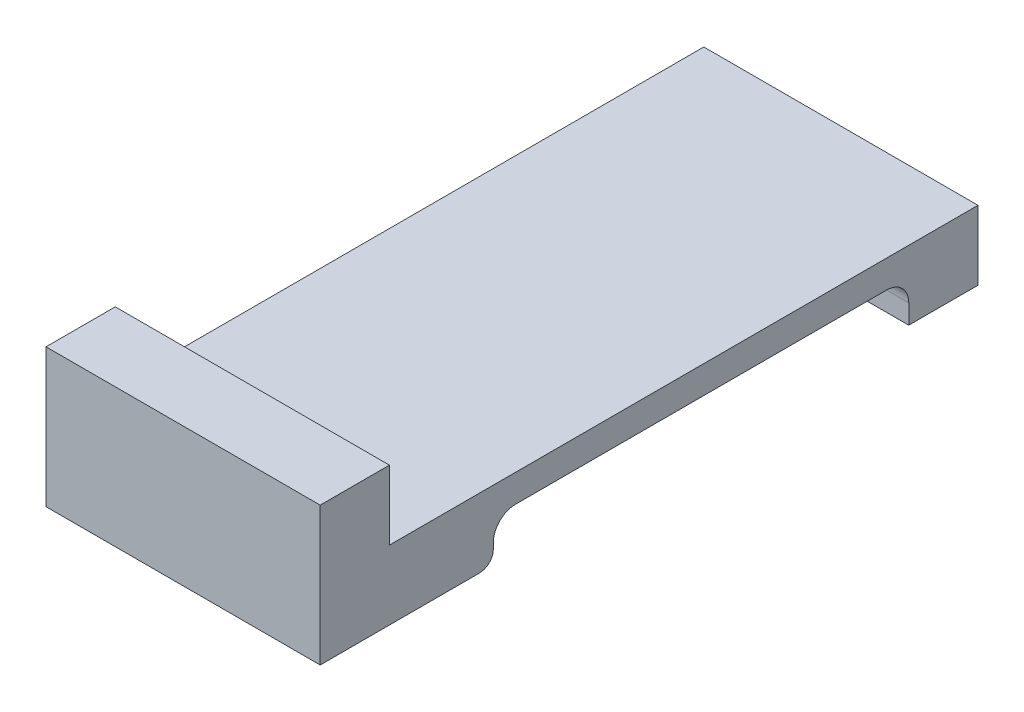
ISO-10303-21;
HEADER;
FILE_DESCRIPTION(('STEP AP214'),'2;1');
FILE_NAME('part.step','',(''),(''),'','','');
FILE_SCHEMA(('AUTOMOTIVE_DESIGN { 1 0 10303 214 1 1 1 1 }'));
ENDSEC;
DATA;
#1=APPLICATION_CONTEXT('core data for automotive mechanical design processes');
#2=APPLICATION_PROTOCOL_DEFINITION('international standard','automotive_design',2000,#1);
#3=PRODUCT_CONTEXT('',#1,'mechanical');
#4=PRODUCT('Part','Part','',(#3));
#5=PRODUCT_RELATED_PRODUCT_CATEGORY('part','',(#4));
#6=PRODUCT_DEFINITION_FORMATION('','',#4);
#7=PRODUCT_DEFINITION_CONTEXT('part definition',#1,'design');
#8=PRODUCT_DEFINITION('design','',#6,#7);
#9=PRODUCT_DEFINITION_SHAPE('','',#8);
#10=(LENGTH_UNIT() NAMED_UNIT(*) SI_UNIT(.MILLI.,.METRE.));
#11=(NAMED_UNIT(*) PLANE_ANGLE_UNIT() SI_UNIT($,.RADIAN.));
#12=(NAMED_UNIT(*) SI_UNIT($,.STERADIAN.) SOLID_ANGLE_UNIT());
#13=UNCERTAINTY_MEASURE_WITH_UNIT(LENGTH_MEASURE(1.E-05),#10,'distance_accuracy_value','');
#14=(GEOMETRIC_REPRESENTATION_CONTEXT(3) GLOBAL_UNCERTAINTY_ASSIGNED_CONTEXT((#13)) GLOBAL_UNIT_ASSIGNED_CONTEXT((#10,
#11,#12)) REPRESENTATION_CONTEXT('',''));
#15=CARTESIAN_POINT('',(0.,0.,0.));
#16=DIRECTION('',(0.,0.,1.));
#17=DIRECTION('',(1.,0.,0.));
#18=AXIS2_PLACEMENT_3D('',#15,#16,#17);
#19=CARTESIAN_POINT('',(12.573,0.,0.));
#20=DIRECTION('',(0.,1.,0.));
#21=DIRECTION('',(0.,0.,1.));
#22=AXIS2_PLACEMENT_3D('',#19,#20,#21);
#23=PLANE('',#22);
#24=DIRECTION('',(0.,0.,-1.));
#25=VECTOR('',#24,1.);
#26=CARTESIAN_POINT('',(0.,0.,0.));
#27=LINE('',#26,#25);
#28=CARTESIAN_POINT('',(0.,0.,0.));
#29=VERTEX_POINT('',#28);
#30=CARTESIAN_POINT('',(0.,0.,-7.3025));
#31=VERTEX_POINT('',#30);
#32=EDGE_CURVE('E170',#29,#31,#27,.T.);
#33=ORIENTED_EDGE('',*,*,#32,.T.);
#34=DIRECTION('',(-1.,0.,0.));
#35=VECTOR('',#34,1.);
#36=CARTESIAN_POINT('',(12.573,0.,-7.3025));
#37=LINE('',#36,#35);
#38=CARTESIAN_POINT('',(12.573,0.,-7.3025));
#39=VERTEX_POINT('',#38);
#40=EDGE_CURVE('E11',#39,#31,#37,.T.);
#41=ORIENTED_EDGE('',*,*,#40,.F.);
#42=DIRECTION('',(0.,0.,-1.));
#43=VECTOR('',#42,1.);
#44=CARTESIAN_POINT('',(12.573,0.,0.));
#45=LINE('',#44,#43);
#46=CARTESIAN_POINT('',(12.573,0.,0.));
#47=VERTEX_POINT('',#46);
#48=EDGE_CURVE('E207',#47,#39,#45,.T.);
#49=ORIENTED_EDGE('',*,*,#48,.F.);
#50=DIRECTION('',(-1.,0.,0.));
#51=VECTOR('',#50,1.);
#52=CARTESIAN_POINT('',(12.573,0.,0.));
#53=LINE('',#52,#51);
#54=EDGE_CURVE('E166',#47,#29,#53,.T.);
#55=ORIENTED_EDGE('',*,*,#54,.T.);
#56=EDGE_LOOP('',(#33,#41,#49,#55));
#57=FACE_BOUND('',#56,.T.);
#58=ADVANCED_FACE('F39',(#57),#23,.F.);
#59=CARTESIAN_POINT('',(12.573,0.634999999999999,-7.3025));
#60=DIRECTION('',(-1.,0.,0.));
#61=DIRECTION('',(0.,0.,1.));
#62=AXIS2_PLACEMENT_3D('',#59,#60,#61);
#63=CYLINDRICAL_SURFACE('',#62,0.635);
#64=CARTESIAN_POINT('',(0.,0.634999999999999,-7.3025));
#65=DIRECTION('',(1.,0.,0.));
#66=DIRECTION('',(0.,0.,-1.));
#67=AXIS2_PLACEMENT_3D('',#64,#65,#66);
#68=CIRCLE('',#67,0.635);
#69=CARTESIAN_POINT('',(0.,0.635000000000004,-7.9375));
#70=VERTEX_POINT('',#69);
#71=EDGE_CURVE('E174',#31,#70,#68,.T.);
#72=ORIENTED_EDGE('',*,*,#71,.T.);
#73=DIRECTION('',(-1.,0.,0.));
#74=VECTOR('',#73,1.);
#75=CARTESIAN_POINT('',(12.573,0.635000000000004,-7.9375));
#76=LINE('',#75,#74);
#77=CARTESIAN_POINT('',(12.573,0.635000000000004,-7.9375));
#78=VERTEX_POINT('',#77);
#79=EDGE_CURVE('E48',#78,#70,#76,.T.);
#80=ORIENTED_EDGE('',*,*,#79,.F.);
#81=CARTESIAN_POINT('',(12.573,0.634999999999999,-7.3025));
#82=DIRECTION('',(1.,0.,0.));
#83=DIRECTION('',(0.,0.,-1.));
#84=AXIS2_PLACEMENT_3D('',#81,#82,#83);
#85=CIRCLE('',#84,0.635);
#86=EDGE_CURVE('E114',#39,#78,#85,.T.);
#87=ORIENTED_EDGE('',*,*,#86,.F.);
#88=ORIENTED_EDGE('',*,*,#40,.T.);
#89=EDGE_LOOP('',(#72,#80,#87,#88));
#90=FACE_BOUND('',#89,.T.);
#91=ADVANCED_FACE('F308',(#90),#63,.T.);
#92=CARTESIAN_POINT('',(12.573,0.635000000000004,-7.9375));
#93=DIRECTION('',(0.,0.,1.));
#94=DIRECTION('',(0.,-1.,0.));
#95=AXIS2_PLACEMENT_3D('',#92,#93,#94);
#96=PLANE('',#95);
#97=DIRECTION('',(0.,1.,0.));
#98=VECTOR('',#97,1.);
#99=CARTESIAN_POINT('',(0.,0.635000000000004,-7.9375));
#100=LINE('',#99,#98);
#101=CARTESIAN_POINT('',(0.,0.889,-7.9375));
#102=VERTEX_POINT('',#101);
#103=EDGE_CURVE('E177',#70,#102,#100,.T.);
#104=ORIENTED_EDGE('',*,*,#103,.T.);
#105=DIRECTION('',(-1.,0.,0.));
#106=VECTOR('',#105,1.);
#107=CARTESIAN_POINT('',(12.573,0.889,-7.9375));
#108=LINE('',#107,#106);
#109=CARTESIAN_POINT('',(12.573,0.889,-7.9375));
#110=VERTEX_POINT('',#109);
#111=EDGE_CURVE('E238',#110,#102,#108,.T.);
#112=ORIENTED_EDGE('',*,*,#111,.F.);
#113=DIRECTION('',(0.,1.,0.));
#114=VECTOR('',#113,1.);
#115=CARTESIAN_POINT('',(12.573,0.635000000000004,-7.9375));
#116=LINE('',#115,#114);
#117=EDGE_CURVE('E248',#78,#110,#116,.T.);
#118=ORIENTED_EDGE('',*,*,#117,.F.);
#119=ORIENTED_EDGE('',*,*,#79,.T.);
#120=EDGE_LOOP('',(#104,#112,#118,#119));
#121=FACE_BOUND('',#120,.T.);
#122=ADVANCED_FACE('F246',(#121),#96,.F.);
#123=CARTESIAN_POINT('',(12.573,0.889,-8.9535));
#124=DIRECTION('',(-1.,0.,0.));
#125=DIRECTION('',(0.,0.,1.));
#126=AXIS2_PLACEMENT_3D('',#123,#124,#125);
#127=CYLINDRICAL_SURFACE('',#126,1.016);
#128=CARTESIAN_POINT('',(0.,0.889,-8.9535));
#129=DIRECTION('',(-1.,0.,0.));
#130=DIRECTION('',(0.,0.,1.));
#131=AXIS2_PLACEMENT_3D('',#128,#129,#130);
#132=CIRCLE('',#131,1.016);
#133=CARTESIAN_POINT('',(0.,1.905,-8.9535));
#134=VERTEX_POINT('',#133);
#135=EDGE_CURVE('E180',#102,#134,#132,.T.);
#136=ORIENTED_EDGE('',*,*,#135,.T.);
#137=DIRECTION('',(-1.,0.,0.));
#138=VECTOR('',#137,1.);
#139=CARTESIAN_POINT('',(12.573,1.905,-8.9535));
#140=LINE('',#139,#138);
#141=CARTESIAN_POINT('',(12.573,1.905,-8.9535));
#142=VERTEX_POINT('',#141);
#143=EDGE_CURVE('E234',#142,#134,#140,.T.);
#144=ORIENTED_EDGE('',*,*,#143,.F.);
#145=CARTESIAN_POINT('',(12.573,0.889,-8.9535));
#146=DIRECTION('',(-1.,0.,0.));
#147=DIRECTION('',(0.,0.,1.));
#148=AXIS2_PLACEMENT_3D('',#145,#146,#147);
#149=CIRCLE('',#148,1.016);
#150=EDGE_CURVE('E267',#110,#142,#149,.T.);
#151=ORIENTED_EDGE('',*,*,#150,.F.);
#152=ORIENTED_EDGE('',*,*,#111,.T.);
#153=EDGE_LOOP('',(#136,#144,#151,#152));
#154=FACE_BOUND('',#153,.T.);
#155=ADVANCED_FACE('F257',(#154),#127,.F.);
#156=CARTESIAN_POINT('',(12.573,1.905,-8.9535));
#157=DIRECTION('',(0.,1.,0.));
#158=DIRECTION('',(0.,0.,1.));
#159=AXIS2_PLACEMENT_3D('',#156,#157,#158);
#160=PLANE('',#159);
#161=DIRECTION('',(0.,0.,-1.));
#162=VECTOR('',#161,1.);
#163=CARTESIAN_POINT('',(0.,1.905,-8.9535));
#164=LINE('',#163,#162);
#165=CARTESIAN_POINT('',(0.,1.905,-25.9715));
#166=VERTEX_POINT('',#165);
#167=EDGE_CURVE('E183',#134,#166,#164,.T.);
#168=ORIENTED_EDGE('',*,*,#167,.T.);
#169=DIRECTION('',(-1.,0.,0.));
#170=VECTOR('',#169,1.);
#171=CARTESIAN_POINT('',(12.573,1.905,-25.9715));
#172=LINE('',#171,#170);
#173=CARTESIAN_POINT('',(12.573,1.905,-25.9715));
#174=VERTEX_POINT('',#173);
#175=EDGE_CURVE('E230',#174,#166,#172,.T.);
#176=ORIENTED_EDGE('',*,*,#175,.F.);
#177=DIRECTION('',(0.,0.,-1.));
#178=VECTOR('',#177,1.);
#179=CARTESIAN_POINT('',(12.573,1.905,-8.9535));
#180=LINE('',#179,#178);
#181=EDGE_CURVE('E263',#142,#174,#180,.T.);
#182=ORIENTED_EDGE('',*,*,#181,.F.);
#183=ORIENTED_EDGE('',*,*,#143,.T.);
#184=EDGE_LOOP('',(#168,#176,#182,#183));
#185=FACE_BOUND('',#184,.T.);
#186=ADVANCED_FACE('F261',(#185),#160,.F.);
#187=CARTESIAN_POINT('',(12.573,0.889,-25.9715));
#188=DIRECTION('',(-1.,0.,0.));
#189=DIRECTION('',(0.,0.,1.));
#190=AXIS2_PLACEMENT_3D('',#187,#188,#189);
#191=CYLINDRICAL_SURFACE('',#190,1.016);
#192=CARTESIAN_POINT('',(0.,0.889,-25.9715));
#193=DIRECTION('',(-1.,0.,0.));
#194=DIRECTION('',(0.,0.,1.));
#195=AXIS2_PLACEMENT_3D('',#192,#193,#194);
#196=CIRCLE('',#195,1.016);
#197=CARTESIAN_POINT('',(0.,0.889,-26.9875));
#198=VERTEX_POINT('',#197);
#199=EDGE_CURVE('E186',#166,#198,#196,.T.);
#200=ORIENTED_EDGE('',*,*,#199,.T.);
#201=DIRECTION('',(-1.,0.,0.));
#202=VECTOR('',#201,1.);
#203=CARTESIAN_POINT('',(12.573,0.889,-26.9875));
#204=LINE('',#203,#202);
#205=CARTESIAN_POINT('',(12.573,0.889,-26.9875));
#206=VERTEX_POINT('',#205);
#207=EDGE_CURVE('E226',#206,#198,#204,.T.);
#208=ORIENTED_EDGE('',*,*,#207,.F.);
#209=CARTESIAN_POINT('',(12.573,0.889,-25.9715));
#210=DIRECTION('',(-1.,0.,0.));
#211=DIRECTION('',(0.,0.,1.));
#212=AXIS2_PLACEMENT_3D('',#209,#210,#211);
#213=CIRCLE('',#212,1.016);
#214=EDGE_CURVE('E266',#174,#206,#213,.T.);
#215=ORIENTED_EDGE('',*,*,#214,.F.);
#216=ORIENTED_EDGE('',*,*,#175,.T.);
#217=EDGE_LOOP('',(#200,#208,#215,#216));
#218=FACE_BOUND('',#217,.T.);
#219=ADVANCED_FACE('F321',(#218),#191,.F.);
#220=CARTESIAN_POINT('',(12.573,0.889,-26.9875));
#221=DIRECTION('',(0.,0.,-1.));
#222=DIRECTION('',(0.,1.,0.));
#223=AXIS2_PLACEMENT_3D('',#220,#221,#222);
#224=PLANE('',#223);
#225=DIRECTION('',(0.,-1.,0.));
#226=VECTOR('',#225,1.);
#227=CARTESIAN_POINT('',(0.,0.889,-26.9875));
#228=LINE('',#227,#226);
#229=CARTESIAN_POINT('',(0.,0.,-26.9875));
#230=VERTEX_POINT('',#229);
#231=EDGE_CURVE('E189',#198,#230,#228,.T.);
#232=ORIENTED_EDGE('',*,*,#231,.T.);
#233=DIRECTION('',(-1.,0.,0.));
#234=VECTOR('',#233,1.);
#235=CARTESIAN_POINT('',(12.573,0.,-26.9875));
#236=LINE('',#235,#234);
#237=CARTESIAN_POINT('',(12.573,0.,-26.9875));
#238=VERTEX_POINT('',#237);
#239=EDGE_CURVE('E222',#238,#230,#236,.T.);
#240=ORIENTED_EDGE('',*,*,#239,.F.);
#241=DIRECTION('',(0.,-1.,0.));
#242=VECTOR('',#241,1.);
#243=CARTESIAN_POINT('',(12.573,0.889,-26.9875));
#244=LINE('',#243,#242);
#245=EDGE_CURVE('E271',#206,#238,#244,.T.);
#246=ORIENTED_EDGE('',*,*,#245,.F.);
#247=ORIENTED_EDGE('',*,*,#207,.T.);
#248=EDGE_LOOP('',(#232,#240,#246,#247));
#249=FACE_BOUND('',#248,.T.);
#250=ADVANCED_FACE('F324',(#249),#224,.F.);
#251=CARTESIAN_POINT('',(12.573,0.,-30.1625));
#252=DIRECTION('',(0.,1.,0.));
#253=DIRECTION('',(0.,0.,1.));
#254=AXIS2_PLACEMENT_3D('',#251,#252,#253);
#255=PLANE('',#254);
#256=DIRECTION('',(0.,0.,-1.));
#257=VECTOR('',#256,1.);
#258=CARTESIAN_POINT('',(0.,0.,-30.1625));
#259=LINE('',#258,#257);
#260=CARTESIAN_POINT('',(0.,0.,-30.1625));
#261=VERTEX_POINT('',#260);
#262=EDGE_CURVE('E192',#230,#261,#259,.T.);
#263=ORIENTED_EDGE('',*,*,#262,.T.);
#264=DIRECTION('',(-1.,0.,0.));
#265=VECTOR('',#264,1.);
#266=CARTESIAN_POINT('',(12.573,0.,-30.1625));
#267=LINE('',#266,#265);
#268=CARTESIAN_POINT('',(12.573,0.,-30.1625));
#269=VERTEX_POINT('',#268);
#270=EDGE_CURVE('E218',#269,#261,#267,.T.);
#271=ORIENTED_EDGE('',*,*,#270,.F.);
#272=DIRECTION('',(0.,0.,-1.));
#273=VECTOR('',#272,1.);
#274=CARTESIAN_POINT('',(12.573,0.,-30.1625));
#275=LINE('',#274,#273);
#276=EDGE_CURVE('E278',#238,#269,#275,.T.);
#277=ORIENTED_EDGE('',*,*,#276,.F.);
#278=ORIENTED_EDGE('',*,*,#239,.T.);
#279=EDGE_LOOP('',(#263,#271,#277,#278));
#280=FACE_BOUND('',#279,.T.);
#281=ADVANCED_FACE('F328',(#280),#255,.F.);
#282=CARTESIAN_POINT('',(12.573,3.175,-30.1625));
#283=DIRECTION('',(0.,0.,1.));
#284=DIRECTION('',(1.,0.,0.));
#285=AXIS2_PLACEMENT_3D('',#282,#283,#284);
#286=PLANE('',#285);
#287=DIRECTION('',(0.,1.,0.));
#288=VECTOR('',#287,1.);
#289=CARTESIAN_POINT('',(0.,3.175,-30.1625));
#290=LINE('',#289,#288);
#291=CARTESIAN_POINT('',(0.,3.175,-30.1625));
#292=VERTEX_POINT('',#291);
#293=EDGE_CURVE('E195',#261,#292,#290,.T.);
#294=ORIENTED_EDGE('',*,*,#293,.T.);
#295=DIRECTION('',(-1.,0.,0.));
#296=VECTOR('',#295,1.);
#297=CARTESIAN_POINT('',(12.573,3.175,-30.1625));
#298=LINE('',#297,#296);
#299=CARTESIAN_POINT('',(12.573,3.175,-30.1625));
#300=VERTEX_POINT('',#299);
#301=EDGE_CURVE('E214',#300,#292,#298,.T.);
#302=ORIENTED_EDGE('',*,*,#301,.F.);
#303=DIRECTION('',(0.,1.,0.));
#304=VECTOR('',#303,1.);
#305=CARTESIAN_POINT('',(12.573,3.175,-30.1625));
#306=LINE('',#305,#304);
#307=EDGE_CURVE('E281',#269,#300,#306,.T.);
#308=ORIENTED_EDGE('',*,*,#307,.F.);
#309=ORIENTED_EDGE('',*,*,#270,.T.);
#310=EDGE_LOOP('',(#294,#302,#308,#309));
#311=FACE_BOUND('',#310,.T.);
#312=ADVANCED_FACE('F289',(#311),#286,.F.);
#313=CARTESIAN_POINT('',(12.573,3.175,-3.175));
#314=DIRECTION('',(0.,-1.,0.));
#315=DIRECTION('',(0.,0.,-1.));
#316=AXIS2_PLACEMENT_3D('',#313,#314,#315);
#317=PLANE('',#316);
#318=DIRECTION('',(0.,0.,1.));
#319=VECTOR('',#318,1.);
#320=CARTESIAN_POINT('',(0.,3.175,-3.175));
#321=LINE('',#320,#319);
#322=CARTESIAN_POINT('',(0.,3.175,-3.175));
#323=VERTEX_POINT('',#322);
#324=EDGE_CURVE('E198',#292,#323,#321,.T.);
#325=ORIENTED_EDGE('',*,*,#324,.T.);
#326=DIRECTION('',(-1.,0.,0.));
#327=VECTOR('',#326,1.);
#328=CARTESIAN_POINT('',(12.573,3.175,-3.175));
#329=LINE('',#328,#327);
#330=CARTESIAN_POINT('',(12.573,3.175,-3.175));
#331=VERTEX_POINT('',#330);
#332=EDGE_CURVE('E159',#331,#323,#329,.T.);
#333=ORIENTED_EDGE('',*,*,#332,.F.);
#334=DIRECTION('',(0.,0.,1.));
#335=VECTOR('',#334,1.);
#336=CARTESIAN_POINT('',(12.573,3.175,-3.175));
#337=LINE('',#336,#335);
#338=EDGE_CURVE('E148',#300,#331,#337,.T.);
#339=ORIENTED_EDGE('',*,*,#338,.F.);
#340=ORIENTED_EDGE('',*,*,#301,.T.);
#341=EDGE_LOOP('',(#325,#333,#339,#340));
#342=FACE_BOUND('',#341,.T.);
#343=ADVANCED_FACE('F293',(#342),#317,.F.);
#344=CARTESIAN_POINT('',(12.573,6.35,-3.175));
#345=DIRECTION('',(0.,0.,1.));
#346=DIRECTION('',(1.,0.,0.));
#347=AXIS2_PLACEMENT_3D('',#344,#345,#346);
#348=PLANE('',#347);
#349=DIRECTION('',(0.,1.,0.));
#350=VECTOR('',#349,1.);
#351=CARTESIAN_POINT('',(0.,6.35,-3.175));
#352=LINE('',#351,#350);
#353=CARTESIAN_POINT('',(0.,6.35,-3.175));
#354=VERTEX_POINT('',#353);
#355=EDGE_CURVE('E157',#323,#354,#352,.T.);
#356=ORIENTED_EDGE('',*,*,#355,.T.);
#357=DIRECTION('',(-1.,0.,0.));
#358=VECTOR('',#357,1.);
#359=CARTESIAN_POINT('',(12.573,6.35,-3.175));
#360=LINE('',#359,#358);
#361=CARTESIAN_POINT('',(12.573,6.35,-3.175));
#362=VERTEX_POINT('',#361);
#363=EDGE_CURVE('E154',#362,#354,#360,.T.);
#364=ORIENTED_EDGE('',*,*,#363,.F.);
#365=DIRECTION('',(0.,1.,0.));
#366=VECTOR('',#365,1.);
#367=CARTESIAN_POINT('',(12.573,6.35,-3.175));
#368=LINE('',#367,#366);
#369=EDGE_CURVE('E142',#331,#362,#368,.T.);
#370=ORIENTED_EDGE('',*,*,#369,.F.);
#371=ORIENTED_EDGE('',*,*,#332,.T.);
#372=EDGE_LOOP('',(#356,#364,#370,#371));
#373=FACE_BOUND('',#372,.T.);
#374=ADVANCED_FACE('F155',(#373),#348,.F.);
#375=CARTESIAN_POINT('',(12.573,6.35,0.));
#376=DIRECTION('',(0.,-1.,0.));
#377=DIRECTION('',(0.,0.,-1.));
#378=AXIS2_PLACEMENT_3D('',#375,#376,#377);
#379=PLANE('',#378);
#380=DIRECTION('',(0.,0.,1.));
#381=VECTOR('',#380,1.);
#382=CARTESIAN_POINT('',(0.,6.35,0.));
#383=LINE('',#382,#381);
#384=CARTESIAN_POINT('',(0.,6.35,0.));
#385=VERTEX_POINT('',#384);
#386=EDGE_CURVE('E100',#354,#385,#383,.T.);
#387=ORIENTED_EDGE('',*,*,#386,.T.);
#388=DIRECTION('',(-1.,0.,0.));
#389=VECTOR('',#388,1.);
#390=CARTESIAN_POINT('',(12.573,6.35,0.));
#391=LINE('',#390,#389);
#392=CARTESIAN_POINT('',(12.573,6.35,0.));
#393=VERTEX_POINT('',#392);
#394=EDGE_CURVE('E160',#393,#385,#391,.T.);
#395=ORIENTED_EDGE('',*,*,#394,.F.);
#396=DIRECTION('',(0.,0.,1.));
#397=VECTOR('',#396,1.);
#398=CARTESIAN_POINT('',(12.573,6.35,0.));
#399=LINE('',#398,#397);
#400=EDGE_CURVE('E146',#362,#393,#399,.T.);
#401=ORIENTED_EDGE('',*,*,#400,.F.);
#402=ORIENTED_EDGE('',*,*,#363,.T.);
#403=EDGE_LOOP('',(#387,#395,#401,#402));
#404=FACE_BOUND('',#403,.T.);
#405=ADVANCED_FACE('F162',(#404),#379,.F.);
#406=CARTESIAN_POINT('',(12.573,0.,0.));
#407=DIRECTION('',(0.,0.,-1.));
#408=DIRECTION('',(-1.,0.,0.));
#409=AXIS2_PLACEMENT_3D('',#406,#407,#408);
#410=PLANE('',#409);
#411=DIRECTION('',(0.,-1.,0.));
#412=VECTOR('',#411,1.);
#413=CARTESIAN_POINT('',(0.,0.,0.));
#414=LINE('',#413,#412);
#415=EDGE_CURVE('E106',#385,#29,#414,.T.);
#416=ORIENTED_EDGE('',*,*,#415,.T.);
#417=ORIENTED_EDGE('',*,*,#54,.F.);
#418=DIRECTION('',(0.,-1.,0.));
#419=VECTOR('',#418,1.);
#420=CARTESIAN_POINT('',(12.573,0.,0.));
#421=LINE('',#420,#419);
#422=EDGE_CURVE('E56',#393,#47,#421,.T.);
#423=ORIENTED_EDGE('',*,*,#422,.F.);
#424=ORIENTED_EDGE('',*,*,#394,.T.);
#425=EDGE_LOOP('',(#416,#417,#423,#424));
#426=FACE_BOUND('',#425,.T.);
#427=ADVANCED_FACE('F297',(#426),#410,.F.);
#428=CARTESIAN_POINT('',(12.573,0.634999999999999,-7.3025));
#429=DIRECTION('',(1.,0.,0.));
#430=DIRECTION('',(0.,0.,-1.));
#431=AXIS2_PLACEMENT_3D('',#428,#429,#430);
#432=PLANE('',#431);
#433=ORIENTED_EDGE('',*,*,#48,.T.);
#434=ORIENTED_EDGE('',*,*,#86,.T.);
#435=ORIENTED_EDGE('',*,*,#117,.T.);
#436=ORIENTED_EDGE('',*,*,#150,.T.);
#437=ORIENTED_EDGE('',*,*,#181,.T.);
#438=ORIENTED_EDGE('',*,*,#214,.T.);
#439=ORIENTED_EDGE('',*,*,#245,.T.);
#440=ORIENTED_EDGE('',*,*,#276,.T.);
#441=ORIENTED_EDGE('',*,*,#307,.T.);
#442=ORIENTED_EDGE('',*,*,#338,.T.);
#443=ORIENTED_EDGE('',*,*,#369,.T.);
#444=ORIENTED_EDGE('',*,*,#400,.T.);
#445=ORIENTED_EDGE('',*,*,#422,.T.);
#446=EDGE_LOOP('',(#433,#434,#435,#436,#437,#438,#439,#440,#441,#442,#443,#444,#445));
#447=FACE_BOUND('',#446,.T.);
#448=ADVANCED_FACE('F144',(#447),#432,.T.);
#449=CARTESIAN_POINT('',(0.,0.634999999999999,-7.3025));
#450=DIRECTION('',(1.,0.,0.));
#451=DIRECTION('',(0.,0.,-1.));
#452=AXIS2_PLACEMENT_3D('',#449,#450,#451);
#453=PLANE('',#452);
#454=ORIENTED_EDGE('',*,*,#32,.F.);
#455=ORIENTED_EDGE('',*,*,#415,.F.);
#456=ORIENTED_EDGE('',*,*,#386,.F.);
#457=ORIENTED_EDGE('',*,*,#355,.F.);
#458=ORIENTED_EDGE('',*,*,#324,.F.);
#459=ORIENTED_EDGE('',*,*,#293,.F.);
#460=ORIENTED_EDGE('',*,*,#262,.F.);
#461=ORIENTED_EDGE('',*,*,#231,.F.);
#462=ORIENTED_EDGE('',*,*,#199,.F.);
#463=ORIENTED_EDGE('',*,*,#167,.F.);
#464=ORIENTED_EDGE('',*,*,#135,.F.);
#465=ORIENTED_EDGE('',*,*,#103,.F.);
#466=ORIENTED_EDGE('',*,*,#71,.F.);
#467=EDGE_LOOP('',(#454,#455,#456,#457,#458,#459,#460,#461,#462,#463,#464,#465,#466));
#468=FACE_BOUND('',#467,.T.);
#469=ADVANCED_FACE('F252',(#468),#453,.F.);
#470=CLOSED_SHELL('',(#58,#91,#122,#155,#186,#219,#250,#281,#312,#343,#374,#405,#427,#448,#469));
#471=MANIFOLD_SOLID_BREP('B2',#470);
#472=ADVANCED_BREP_SHAPE_REPRESENTATION('',(#18,#471),#14);
#473=SHAPE_DEFINITION_REPRESENTATION(#9,#472);
ENDSEC;
END-ISO-10303-21;
